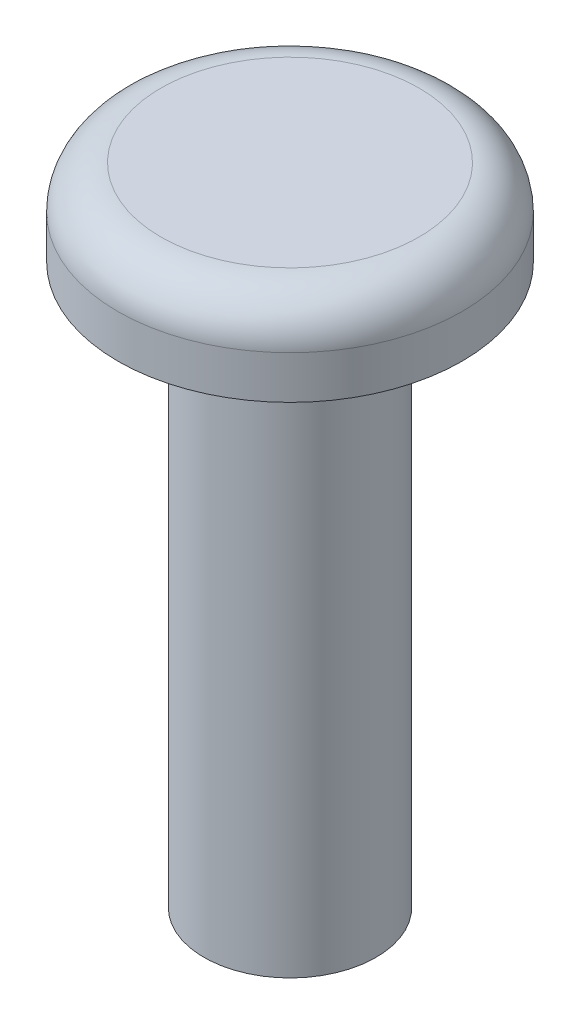
ISO-10303-21;
HEADER;
FILE_DESCRIPTION(('STEP AP214'),'2;1');
FILE_NAME('part.step','',(''),(''),'','','');
FILE_SCHEMA(('AUTOMOTIVE_DESIGN { 1 0 10303 214 1 1 1 1 }'));
ENDSEC;
DATA;
#1=APPLICATION_CONTEXT('core data for automotive mechanical design processes');
#2=APPLICATION_PROTOCOL_DEFINITION('international standard','automotive_design',2000,#1);
#3=PRODUCT_CONTEXT('',#1,'mechanical');
#4=PRODUCT('Part','Part','',(#3));
#5=PRODUCT_RELATED_PRODUCT_CATEGORY('part','',(#4));
#6=PRODUCT_DEFINITION_FORMATION('','',#4);
#7=PRODUCT_DEFINITION_CONTEXT('part definition',#1,'design');
#8=PRODUCT_DEFINITION('design','',#6,#7);
#9=PRODUCT_DEFINITION_SHAPE('','',#8);
#10=(LENGTH_UNIT() NAMED_UNIT(*) SI_UNIT(.MILLI.,.METRE.));
#11=(NAMED_UNIT(*) PLANE_ANGLE_UNIT() SI_UNIT($,.RADIAN.));
#12=(NAMED_UNIT(*) SI_UNIT($,.STERADIAN.) SOLID_ANGLE_UNIT());
#13=UNCERTAINTY_MEASURE_WITH_UNIT(LENGTH_MEASURE(1.E-05),#10,'distance_accuracy_value','');
#14=(GEOMETRIC_REPRESENTATION_CONTEXT(3) GLOBAL_UNCERTAINTY_ASSIGNED_CONTEXT((#13)) GLOBAL_UNIT_ASSIGNED_CONTEXT((#10,
#11,#12)) REPRESENTATION_CONTEXT('',''));
#15=CARTESIAN_POINT('',(0.,0.,0.));
#16=DIRECTION('',(0.,0.,1.));
#17=DIRECTION('',(1.,0.,0.));
#18=AXIS2_PLACEMENT_3D('',#15,#16,#17);
#19=CARTESIAN_POINT('',(0.,10.,0.));
#20=DIRECTION('',(0.,-1.,0.));
#21=DIRECTION('',(0.,0.,-1.));
#22=AXIS2_PLACEMENT_3D('',#19,#20,#21);
#23=CYLINDRICAL_SURFACE('',#22,20.);
#24=CARTESIAN_POINT('',(0.,5.,0.));
#25=DIRECTION('',(0.,1.,0.));
#26=DIRECTION('',(0.,0.,1.));
#27=AXIS2_PLACEMENT_3D('',#24,#25,#26);
#28=CIRCLE('',#27,20.);
#29=CARTESIAN_POINT('',(0.,5.,20.));
#30=VERTEX_POINT('',#29);
#31=EDGE_CURVE('E10',#30,#30,#28,.F.);
#32=ORIENTED_EDGE('',*,*,#31,.T.);
#33=EDGE_LOOP('',(#32));
#34=FACE_BOUND('',#33,.T.);
#35=CARTESIAN_POINT('',(0.,0.,0.));
#36=DIRECTION('',(0.,1.,0.));
#37=DIRECTION('',(0.,0.,1.));
#38=AXIS2_PLACEMENT_3D('',#35,#36,#37);
#39=CIRCLE('',#38,20.);
#40=CARTESIAN_POINT('',(0.,0.,20.));
#41=VERTEX_POINT('',#40);
#42=EDGE_CURVE('E53',#41,#41,#39,.T.);
#43=ORIENTED_EDGE('',*,*,#42,.T.);
#44=EDGE_LOOP('',(#43));
#45=FACE_BOUND('',#44,.T.);
#46=ADVANCED_FACE('F39',(#34,#45),#23,.T.);
#47=CARTESIAN_POINT('',(0.,10.,0.));
#48=DIRECTION('',(0.,1.,0.));
#49=DIRECTION('',(0.,0.,1.));
#50=AXIS2_PLACEMENT_3D('',#47,#48,#49);
#51=PLANE('',#50);
#52=CARTESIAN_POINT('',(0.,10.,0.));
#53=DIRECTION('',(0.,1.,0.));
#54=DIRECTION('',(0.,0.,1.));
#55=AXIS2_PLACEMENT_3D('',#52,#53,#54);
#56=CIRCLE('',#55,15.);
#57=CARTESIAN_POINT('',(0.,10.,15.));
#58=VERTEX_POINT('',#57);
#59=EDGE_CURVE('E46',#58,#58,#56,.T.);
#60=ORIENTED_EDGE('',*,*,#59,.T.);
#61=EDGE_LOOP('',(#60));
#62=FACE_BOUND('',#61,.T.);
#63=ADVANCED_FACE('F74',(#62),#51,.T.);
#64=CARTESIAN_POINT('',(0.,0.,0.));
#65=DIRECTION('',(0.,1.,0.));
#66=DIRECTION('',(0.,0.,1.));
#67=AXIS2_PLACEMENT_3D('',#64,#65,#66);
#68=PLANE('',#67);
#69=CARTESIAN_POINT('',(0.,0.,0.));
#70=DIRECTION('',(0.,-1.,0.));
#71=DIRECTION('',(0.,0.,-1.));
#72=AXIS2_PLACEMENT_3D('',#69,#70,#71);
#73=CIRCLE('',#72,10.);
#74=CARTESIAN_POINT('',(0.,0.,-10.));
#75=VERTEX_POINT('',#74);
#76=EDGE_CURVE('E49',#75,#75,#73,.T.);
#77=ORIENTED_EDGE('',*,*,#76,.F.);
#78=EDGE_LOOP('',(#77));
#79=FACE_BOUND('',#78,.T.);
#80=ORIENTED_EDGE('',*,*,#42,.F.);
#81=EDGE_LOOP('',(#80));
#82=FACE_BOUND('',#81,.T.);
#83=ADVANCED_FACE('F69',(#79,#82),#68,.F.);
#84=CARTESIAN_POINT('',(0.,-65.,0.));
#85=DIRECTION('',(0.,1.,0.));
#86=DIRECTION('',(0.,0.,1.));
#87=AXIS2_PLACEMENT_3D('',#84,#85,#86);
#88=CYLINDRICAL_SURFACE('',#87,10.);
#89=CARTESIAN_POINT('',(0.,-65.,0.));
#90=DIRECTION('',(0.,-1.,0.));
#91=DIRECTION('',(0.,0.,-1.));
#92=AXIS2_PLACEMENT_3D('',#89,#90,#91);
#93=CIRCLE('',#92,10.);
#94=CARTESIAN_POINT('',(0.,-65.,-10.));
#95=VERTEX_POINT('',#94);
#96=EDGE_CURVE('E59',#95,#95,#93,.T.);
#97=ORIENTED_EDGE('',*,*,#96,.F.);
#98=EDGE_LOOP('',(#97));
#99=FACE_BOUND('',#98,.T.);
#100=ORIENTED_EDGE('',*,*,#76,.T.);
#101=EDGE_LOOP('',(#100));
#102=FACE_BOUND('',#101,.T.);
#103=ADVANCED_FACE('F61',(#99,#102),#88,.T.);
#104=CARTESIAN_POINT('',(0.,-65.,0.));
#105=DIRECTION('',(0.,-1.,0.));
#106=DIRECTION('',(0.,0.,-1.));
#107=AXIS2_PLACEMENT_3D('',#104,#105,#106);
#108=PLANE('',#107);
#109=ORIENTED_EDGE('',*,*,#96,.T.);
#110=EDGE_LOOP('',(#109));
#111=FACE_BOUND('',#110,.T.);
#112=ADVANCED_FACE('F62',(#111),#108,.T.);
#113=CARTESIAN_POINT('',(0.,5.,0.));
#114=DIRECTION('',(0.,1.,0.));
#115=DIRECTION('',(0.,0.,1.));
#116=AXIS2_PLACEMENT_3D('',#113,#114,#115);
#117=TOROIDAL_SURFACE('',#116,15.,5.);
#118=ORIENTED_EDGE('',*,*,#31,.F.);
#119=EDGE_LOOP('',(#118));
#120=FACE_BOUND('',#119,.T.);
#121=ORIENTED_EDGE('',*,*,#59,.F.);
#122=EDGE_LOOP('',(#121));
#123=FACE_BOUND('',#122,.T.);
#124=ADVANCED_FACE('F41',(#120,#123),#117,.T.);
#125=CLOSED_SHELL('',(#46,#63,#83,#103,#112,#124));
#126=MANIFOLD_SOLID_BREP('B2',#125);
#127=ADVANCED_BREP_SHAPE_REPRESENTATION('',(#18,#126),#14);
#128=SHAPE_DEFINITION_REPRESENTATION(#9,#127);
ENDSEC;
END-ISO-10303-21;
